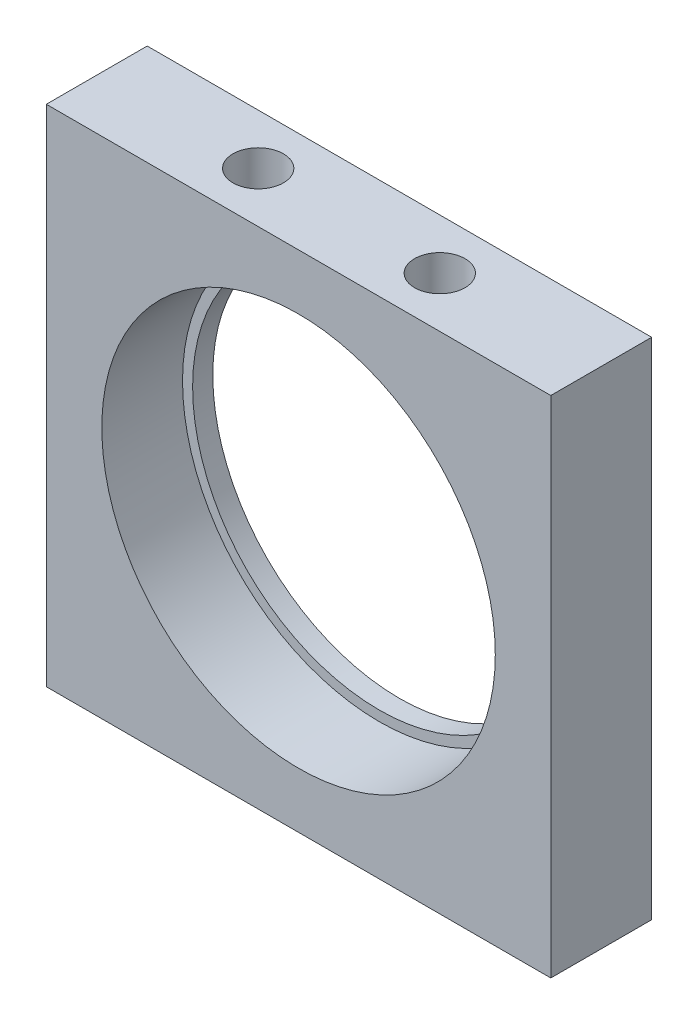
ISO-10303-21;
HEADER;
FILE_DESCRIPTION(('STEP AP214'),'2;1');
FILE_NAME('part.step','',(''),(''),'','','');
FILE_SCHEMA(('AUTOMOTIVE_DESIGN { 1 0 10303 214 1 1 1 1 }'));
ENDSEC;
DATA;
#1=APPLICATION_CONTEXT('core data for automotive mechanical design processes');
#2=APPLICATION_PROTOCOL_DEFINITION('international standard','automotive_design',2000,#1);
#3=PRODUCT_CONTEXT('',#1,'mechanical');
#4=PRODUCT('Part','Part','',(#3));
#5=PRODUCT_RELATED_PRODUCT_CATEGORY('part','',(#4));
#6=PRODUCT_DEFINITION_FORMATION('','',#4);
#7=PRODUCT_DEFINITION_CONTEXT('part definition',#1,'design');
#8=PRODUCT_DEFINITION('design','',#6,#7);
#9=PRODUCT_DEFINITION_SHAPE('','',#8);
#10=(LENGTH_UNIT() NAMED_UNIT(*) SI_UNIT(.MILLI.,.METRE.));
#11=(NAMED_UNIT(*) PLANE_ANGLE_UNIT() SI_UNIT($,.RADIAN.));
#12=(NAMED_UNIT(*) SI_UNIT($,.STERADIAN.) SOLID_ANGLE_UNIT());
#13=UNCERTAINTY_MEASURE_WITH_UNIT(LENGTH_MEASURE(1.E-05),#10,'distance_accuracy_value','');
#14=(GEOMETRIC_REPRESENTATION_CONTEXT(3) GLOBAL_UNCERTAINTY_ASSIGNED_CONTEXT((#13)) GLOBAL_UNIT_ASSIGNED_CONTEXT((#10,
#11,#12)) REPRESENTATION_CONTEXT('',''));
#15=CARTESIAN_POINT('',(0.,0.,0.));
#16=DIRECTION('',(0.,0.,1.));
#17=DIRECTION('',(1.,0.,0.));
#18=AXIS2_PLACEMENT_3D('',#15,#16,#17);
#19=CARTESIAN_POINT('',(-12.5,-12.5,5.));
#20=DIRECTION('',(0.,0.,-1.));
#21=DIRECTION('',(-1.,0.,0.));
#22=AXIS2_PLACEMENT_3D('',#19,#20,#21);
#23=PLANE('',#22);
#24=CARTESIAN_POINT('',(0.,0.,5.));
#25=DIRECTION('',(0.,0.,1.));
#26=DIRECTION('',(1.,0.,0.));
#27=AXIS2_PLACEMENT_3D('',#24,#25,#26);
#28=CIRCLE('',#27,9.75);
#29=CARTESIAN_POINT('',(9.75,0.,5.));
#30=VERTEX_POINT('',#29);
#31=EDGE_CURVE('E185',#30,#30,#28,.T.);
#32=ORIENTED_EDGE('',*,*,#31,.F.);
#33=EDGE_LOOP('',(#32));
#34=FACE_BOUND('',#33,.T.);
#35=DIRECTION('',(0.,-1.,0.));
#36=VECTOR('',#35,1.);
#37=CARTESIAN_POINT('',(-12.5,12.5,5.));
#38=LINE('',#37,#36);
#39=CARTESIAN_POINT('',(-12.5,12.5,5.));
#40=VERTEX_POINT('',#39);
#41=CARTESIAN_POINT('',(-12.5,-12.5,5.));
#42=VERTEX_POINT('',#41);
#43=EDGE_CURVE('E88',#40,#42,#38,.T.);
#44=ORIENTED_EDGE('',*,*,#43,.T.);
#45=DIRECTION('',(1.,0.,0.));
#46=VECTOR('',#45,1.);
#47=CARTESIAN_POINT('',(12.5,-12.5,5.));
#48=LINE('',#47,#46);
#49=CARTESIAN_POINT('',(12.5,-12.5,5.));
#50=VERTEX_POINT('',#49);
#51=EDGE_CURVE('E84',#42,#50,#48,.T.);
#52=ORIENTED_EDGE('',*,*,#51,.T.);
#53=DIRECTION('',(0.,1.,0.));
#54=VECTOR('',#53,1.);
#55=CARTESIAN_POINT('',(12.5,12.5,5.));
#56=LINE('',#55,#54);
#57=CARTESIAN_POINT('',(12.5,12.5,5.));
#58=VERTEX_POINT('',#57);
#59=EDGE_CURVE('E86',#50,#58,#56,.T.);
#60=ORIENTED_EDGE('',*,*,#59,.T.);
#61=DIRECTION('',(-1.,0.,0.));
#62=VECTOR('',#61,1.);
#63=CARTESIAN_POINT('',(12.5,12.5,5.));
#64=LINE('',#63,#62);
#65=EDGE_CURVE('E54',#58,#40,#64,.T.);
#66=ORIENTED_EDGE('',*,*,#65,.T.);
#67=EDGE_LOOP('',(#44,#52,#60,#66));
#68=FACE_BOUND('',#67,.T.);
#69=ADVANCED_FACE('F35',(#34,#68),#23,.F.);
#70=CARTESIAN_POINT('',(-12.5,-12.5,0.));
#71=DIRECTION('',(0.,0.,-1.));
#72=DIRECTION('',(-1.,0.,0.));
#73=AXIS2_PLACEMENT_3D('',#70,#71,#72);
#74=PLANE('',#73);
#75=DIRECTION('',(0.,-1.,0.));
#76=VECTOR('',#75,1.);
#77=CARTESIAN_POINT('',(-12.5,12.5,0.));
#78=LINE('',#77,#76);
#79=CARTESIAN_POINT('',(-12.5,12.5,0.));
#80=VERTEX_POINT('',#79);
#81=CARTESIAN_POINT('',(-12.5,-12.5,0.));
#82=VERTEX_POINT('',#81);
#83=EDGE_CURVE('E101',#80,#82,#78,.T.);
#84=ORIENTED_EDGE('',*,*,#83,.F.);
#85=DIRECTION('',(-1.,0.,0.));
#86=VECTOR('',#85,1.);
#87=CARTESIAN_POINT('',(12.5,12.5,0.));
#88=LINE('',#87,#86);
#89=CARTESIAN_POINT('',(12.5,12.5,0.));
#90=VERTEX_POINT('',#89);
#91=EDGE_CURVE('E77',#90,#80,#88,.T.);
#92=ORIENTED_EDGE('',*,*,#91,.F.);
#93=DIRECTION('',(0.,1.,0.));
#94=VECTOR('',#93,1.);
#95=CARTESIAN_POINT('',(12.5,12.5,0.));
#96=LINE('',#95,#94);
#97=CARTESIAN_POINT('',(12.5,-12.5,0.));
#98=VERTEX_POINT('',#97);
#99=EDGE_CURVE('E71',#98,#90,#96,.T.);
#100=ORIENTED_EDGE('',*,*,#99,.F.);
#101=DIRECTION('',(1.,0.,0.));
#102=VECTOR('',#101,1.);
#103=CARTESIAN_POINT('',(12.5,-12.5,0.));
#104=LINE('',#103,#102);
#105=EDGE_CURVE('E92',#82,#98,#104,.T.);
#106=ORIENTED_EDGE('',*,*,#105,.F.);
#107=EDGE_LOOP('',(#84,#92,#100,#106));
#108=FACE_BOUND('',#107,.T.);
#109=CARTESIAN_POINT('',(0.,0.,0.));
#110=DIRECTION('',(0.,0.,1.));
#111=DIRECTION('',(1.,0.,0.));
#112=AXIS2_PLACEMENT_3D('',#109,#110,#111);
#113=CIRCLE('',#112,9.25);
#114=CARTESIAN_POINT('',(9.25,0.,0.));
#115=VERTEX_POINT('',#114);
#116=EDGE_CURVE('E104',#115,#115,#113,.T.);
#117=ORIENTED_EDGE('',*,*,#116,.T.);
#118=EDGE_LOOP('',(#117));
#119=FACE_BOUND('',#118,.T.);
#120=ADVANCED_FACE('F148',(#108,#119),#74,.T.);
#121=CARTESIAN_POINT('',(-12.5,12.5,5.));
#122=DIRECTION('',(1.,0.,0.));
#123=DIRECTION('',(0.,1.,0.));
#124=AXIS2_PLACEMENT_3D('',#121,#122,#123);
#125=PLANE('',#124);
#126=ORIENTED_EDGE('',*,*,#83,.T.);
#127=DIRECTION('',(0.,0.,-1.));
#128=VECTOR('',#127,1.);
#129=CARTESIAN_POINT('',(-12.5,-12.5,5.));
#130=LINE('',#129,#128);
#131=EDGE_CURVE('E12',#42,#82,#130,.T.);
#132=ORIENTED_EDGE('',*,*,#131,.F.);
#133=ORIENTED_EDGE('',*,*,#43,.F.);
#134=DIRECTION('',(0.,0.,-1.));
#135=VECTOR('',#134,1.);
#136=CARTESIAN_POINT('',(-12.5,12.5,5.));
#137=LINE('',#136,#135);
#138=EDGE_CURVE('E97',#40,#80,#137,.T.);
#139=ORIENTED_EDGE('',*,*,#138,.T.);
#140=EDGE_LOOP('',(#126,#132,#133,#139));
#141=FACE_BOUND('',#140,.T.);
#142=ADVANCED_FACE('F37',(#141),#125,.F.);
#143=CARTESIAN_POINT('',(12.5,-12.5,5.));
#144=DIRECTION('',(0.,1.,0.));
#145=DIRECTION('',(-1.,0.,0.));
#146=AXIS2_PLACEMENT_3D('',#143,#144,#145);
#147=PLANE('',#146);
#148=ORIENTED_EDGE('',*,*,#105,.T.);
#149=DIRECTION('',(0.,0.,-1.));
#150=VECTOR('',#149,1.);
#151=CARTESIAN_POINT('',(12.5,-12.5,5.));
#152=LINE('',#151,#150);
#153=EDGE_CURVE('E45',#50,#98,#152,.T.);
#154=ORIENTED_EDGE('',*,*,#153,.F.);
#155=ORIENTED_EDGE('',*,*,#51,.F.);
#156=ORIENTED_EDGE('',*,*,#131,.T.);
#157=EDGE_LOOP('',(#148,#154,#155,#156));
#158=FACE_BOUND('',#157,.T.);
#159=ADVANCED_FACE('F91',(#158),#147,.F.);
#160=CARTESIAN_POINT('',(12.5,12.5,5.));
#161=DIRECTION('',(-1.,0.,0.));
#162=DIRECTION('',(0.,-1.,0.));
#163=AXIS2_PLACEMENT_3D('',#160,#161,#162);
#164=PLANE('',#163);
#165=ORIENTED_EDGE('',*,*,#99,.T.);
#166=DIRECTION('',(0.,0.,-1.));
#167=VECTOR('',#166,1.);
#168=CARTESIAN_POINT('',(12.5,12.5,5.));
#169=LINE('',#168,#167);
#170=EDGE_CURVE('E93',#58,#90,#169,.T.);
#171=ORIENTED_EDGE('',*,*,#170,.F.);
#172=ORIENTED_EDGE('',*,*,#59,.F.);
#173=ORIENTED_EDGE('',*,*,#153,.T.);
#174=EDGE_LOOP('',(#165,#171,#172,#173));
#175=FACE_BOUND('',#174,.T.);
#176=ADVANCED_FACE('F95',(#175),#164,.F.);
#177=CARTESIAN_POINT('',(12.5,12.5,5.));
#178=DIRECTION('',(0.,-1.,0.));
#179=DIRECTION('',(1.,0.,0.));
#180=AXIS2_PLACEMENT_3D('',#177,#178,#179);
#181=PLANE('',#180);
#182=CARTESIAN_POINT('',(-4.50000000000001,12.5,2.5));
#183=DIRECTION('',(0.,1.,0.));
#184=DIRECTION('',(0.,0.,1.));
#185=AXIS2_PLACEMENT_3D('',#182,#183,#184);
#186=CIRCLE('',#185,1.25);
#187=CARTESIAN_POINT('',(-4.50000000000001,12.5,3.75));
#188=VERTEX_POINT('',#187);
#189=EDGE_CURVE('E134',#188,#188,#186,.T.);
#190=ORIENTED_EDGE('',*,*,#189,.F.);
#191=EDGE_LOOP('',(#190));
#192=FACE_BOUND('',#191,.T.);
#193=CARTESIAN_POINT('',(4.5,12.5,2.5));
#194=DIRECTION('',(0.,1.,0.));
#195=DIRECTION('',(0.,0.,1.));
#196=AXIS2_PLACEMENT_3D('',#193,#194,#195);
#197=CIRCLE('',#196,1.25);
#198=CARTESIAN_POINT('',(4.5,12.5,3.75));
#199=VERTEX_POINT('',#198);
#200=EDGE_CURVE('E169',#199,#199,#197,.T.);
#201=ORIENTED_EDGE('',*,*,#200,.F.);
#202=EDGE_LOOP('',(#201));
#203=FACE_BOUND('',#202,.T.);
#204=ORIENTED_EDGE('',*,*,#91,.T.);
#205=ORIENTED_EDGE('',*,*,#138,.F.);
#206=ORIENTED_EDGE('',*,*,#65,.F.);
#207=ORIENTED_EDGE('',*,*,#170,.T.);
#208=EDGE_LOOP('',(#204,#205,#206,#207));
#209=FACE_BOUND('',#208,.T.);
#210=ADVANCED_FACE('F144',(#192,#203,#209),#181,.F.);
#211=CARTESIAN_POINT('',(0.,0.,5.));
#212=DIRECTION('',(0.,0.,-1.));
#213=DIRECTION('',(-1.,0.,0.));
#214=AXIS2_PLACEMENT_3D('',#211,#212,#213);
#215=CYLINDRICAL_SURFACE('',#214,9.25);
#216=CARTESIAN_POINT('',(0.,0.,1.));
#217=DIRECTION('',(0.,0.,-1.));
#218=DIRECTION('',(-1.,0.,0.));
#219=AXIS2_PLACEMENT_3D('',#216,#217,#218);
#220=CIRCLE('',#219,9.25);
#221=CARTESIAN_POINT('',(-9.25,0.,1.));
#222=VERTEX_POINT('',#221);
#223=EDGE_CURVE('E39',#222,#222,#220,.T.);
#224=ORIENTED_EDGE('',*,*,#223,.F.);
#225=EDGE_LOOP('',(#224));
#226=FACE_BOUND('',#225,.T.);
#227=ORIENTED_EDGE('',*,*,#116,.F.);
#228=EDGE_LOOP('',(#227));
#229=FACE_BOUND('',#228,.T.);
#230=ADVANCED_FACE('F140',(#226,#229),#215,.F.);
#231=CARTESIAN_POINT('',(4.5,12.5,2.5));
#232=DIRECTION('',(0.,1.,0.));
#233=DIRECTION('',(0.,0.,1.));
#234=AXIS2_PLACEMENT_3D('',#231,#232,#233);
#235=CYLINDRICAL_SURFACE('',#234,1.25);
#236=CARTESIAN_POINT('',(4.5,8.6494219460031,3.75));
#237=CARTESIAN_POINT('',(4.42647904401307,8.68767252681186,3.74999935614414));
#238=CARTESIAN_POINT('',(4.35246042268599,8.72498066540459,3.7435092972828));
#239=CARTESIAN_POINT('',(4.20543919023596,8.79678734520722,3.71708966438417));
#240=CARTESIAN_POINT('',(4.1324363570936,8.8312865086303,3.69716307578532));
#241=CARTESIAN_POINT('',(3.98950649545358,8.89677160341226,3.64356666839533));
#242=CARTESIAN_POINT('',(3.91959415829288,8.92774167115214,3.60983769898936));
#243=CARTESIAN_POINT('',(3.78595391413466,8.98522929715541,3.52894565044824));
#244=CARTESIAN_POINT('',(3.7222235012969,9.01174866271871,3.48178804536957));
#245=CARTESIAN_POINT('',(3.60877479364,9.05774190582341,3.37952234099835));
#246=CARTESIAN_POINT('',(3.55833268983893,9.07761774535094,3.32539827596536));
#247=CARTESIAN_POINT('',(3.46726973492604,9.11278935782523,3.20814475351491));
#248=CARTESIAN_POINT('',(3.42664383387611,9.12808748674172,3.14501995321173));
#249=CARTESIAN_POINT('',(3.3598394417507,9.15287671831459,3.01703786261558));
#250=CARTESIAN_POINT('',(3.33277125966542,9.16273189934026,2.95271416621646));
#251=CARTESIAN_POINT('',(3.28964462609119,9.17830427222974,2.82000427037378));
#252=CARTESIAN_POINT('',(3.27358297923091,9.18402266509548,2.75161925626538));
#253=CARTESIAN_POINT('',(3.25357774079943,9.19112830478094,2.61590591824626));
#254=CARTESIAN_POINT('',(3.2491423102919,9.19269138225856,2.54865880762669));
#255=CARTESIAN_POINT('',(3.25113138279628,9.19198816147049,2.41434942411091));
#256=CARTESIAN_POINT('',(3.25755460004429,9.18972231658451,2.34728713027246));
#257=CARTESIAN_POINT('',(3.28086098744651,9.18142685032465,2.21613198168981));
#258=CARTESIAN_POINT('',(3.29761089051569,9.17544517482748,2.15201230450777));
#259=CARTESIAN_POINT('',(3.34082319757586,9.15979937950262,2.0276179960784));
#260=CARTESIAN_POINT('',(3.36728563972061,9.15013524520912,1.96734337993671));
#261=CARTESIAN_POINT('',(3.42933992050219,9.12706041032305,1.85149544052908));
#262=CARTESIAN_POINT('',(3.46504064185647,9.11360484294994,1.79598949622893));
#263=CARTESIAN_POINT('',(3.54412534679001,9.08314190333844,1.69186635065665));
#264=CARTESIAN_POINT('',(3.58751027701339,9.06613409344075,1.64324999946705));
#265=CARTESIAN_POINT('',(3.68231430040483,9.02805430793769,1.55217269579069));
#266=CARTESIAN_POINT('',(3.73398009190832,9.00685007861705,1.51002437111578));
#267=CARTESIAN_POINT('',(3.84231618197041,8.96116970021547,1.4349652390239));
#268=CARTESIAN_POINT('',(3.89898776990057,8.93669270731118,1.40205682075704));
#269=CARTESIAN_POINT('',(4.01966391262861,8.88309892019418,1.34390117253012));
#270=CARTESIAN_POINT('',(4.08390486811086,8.85377918084761,1.31933287348266));
#271=CARTESIAN_POINT('',(4.21432413824495,8.79244974670136,1.28118437458149));
#272=CARTESIAN_POINT('',(4.2805031836064,8.76043902859919,1.26760837584086));
#273=CARTESIAN_POINT('',(4.41929041427393,8.69131265051521,1.25047421980043));
#274=CARTESIAN_POINT('',(4.49192810018223,8.6539985283569,1.24795660628319));
#275=CARTESIAN_POINT('',(4.63574546936008,8.57782015735402,1.25530562924678));
#276=CARTESIAN_POINT('',(4.70692456168974,8.5389552983236,1.26517718810178));
#277=CARTESIAN_POINT('',(4.85243189518405,8.4571840423471,1.29819396986848));
#278=CARTESIAN_POINT('',(4.92648315681509,8.41422382474772,1.32243438020245));
#279=CARTESIAN_POINT('',(5.06924164956709,8.32899825507054,1.38441666728189));
#280=CARTESIAN_POINT('',(5.13794415991285,8.2867335422109,1.42217030987404));
#281=CARTESIAN_POINT('',(5.26980027008964,8.20353206627536,1.51185289968367));
#282=CARTESIAN_POINT('',(5.33276015083278,8.16265956387328,1.56412889190913));
#283=CARTESIAN_POINT('',(5.44858694574485,8.08580358835116,1.68178940860738));
#284=CARTESIAN_POINT('',(5.5014728025841,8.04981097683476,1.747148847175));
#285=CARTESIAN_POINT('',(5.58090998546863,7.99484676417099,1.86927705969086));
#286=CARTESIAN_POINT('',(5.61066100587826,7.97395676004386,1.92311231186616));
#287=CARTESIAN_POINT('',(5.66236293132863,7.93732638465802,2.03604082301111));
#288=CARTESIAN_POINT('',(5.68432053482804,7.92158159200646,2.09512951174138));
#289=CARTESIAN_POINT('',(5.71936455640636,7.89631859967107,2.21763099911013));
#290=CARTESIAN_POINT('',(5.73239170892156,7.88684201226052,2.28106966979122));
#291=CARTESIAN_POINT('',(5.74842953314975,7.87516114723848,2.40985756613575));
#292=CARTESIAN_POINT('',(5.75144575159986,7.87295284251061,2.47520571356354));
#293=CARTESIAN_POINT('',(5.74748405415644,7.87584441750188,2.59826801718392));
#294=CARTESIAN_POINT('',(5.74155851166513,7.88017478397993,2.65603869154882));
#295=CARTESIAN_POINT('',(5.72195427200127,7.89442108003648,2.76952536337789));
#296=CARTESIAN_POINT('',(5.70827504844506,7.90433738883442,2.82524122107065));
#297=CARTESIAN_POINT('',(5.67376917656883,7.92914198921919,2.93361678857137));
#298=CARTESIAN_POINT('',(5.65289790081489,7.94406130910874,2.98625495697252));
#299=CARTESIAN_POINT('',(5.60492211683468,7.97798279488953,3.08717355506656));
#300=CARTESIAN_POINT('',(5.57781538486513,7.99698641720144,3.13545242153273));
#301=CARTESIAN_POINT('',(5.51421962446085,8.04099294917224,3.23328579679062));
#302=CARTESIAN_POINT('',(5.47695697037633,8.06645985553688,3.28212668011423));
#303=CARTESIAN_POINT('',(5.39671139071474,8.1203661575268,3.37297660334663));
#304=CARTESIAN_POINT('',(5.35372497753922,8.14880736316515,3.41498144296478));
#305=CARTESIAN_POINT('',(5.25486887266755,8.21297211378566,3.49879474441473));
#306=CARTESIAN_POINT('',(5.19807193975923,8.24908614105253,3.53921290849355));
#307=CARTESIAN_POINT('',(5.07928186661258,8.32275741215063,3.60982577432532));
#308=CARTESIAN_POINT('',(5.0172852185725,8.36031562084529,3.64001350414208));
#309=CARTESIAN_POINT('',(4.88150316535907,8.44040068376708,3.69284943958863));
#310=CARTESIAN_POINT('',(4.80720411144179,8.48297241896068,3.71412044839279));
#311=CARTESIAN_POINT('',(4.6554566493717,8.56719037574786,3.74269558494595));
#312=CARTESIAN_POINT('',(4.57800846042724,8.60883666145008,3.75000068315493));
#313=CARTESIAN_POINT('',(4.5,8.6494219460031,3.75));
#314=B_SPLINE_CURVE_WITH_KNOTS('',3,(#236,#237,#238,#239,#240,#241,#242,#243,#244,#245,#246,
#247,#248,#249,#250,#251,#252,#253,#254,#255,#256,#257,#258,#259,#260,#261,#262,#263,#264,#265,
#266,#267,#268,#269,#270,#271,#272,#273,#274,#275,#276,#277,#278,#279,#280,#281,#282,#283,#284,
#285,#286,#287,#288,#289,#290,#291,#292,#293,#294,#295,#296,#297,#298,#299,#300,#301,#302,#303,
#304,#305,#306,#307,#308,#309,#310,#311,#312,#313),.UNSPECIFIED.,.T.,.F.,(4,2,2,2,2,2,2,2,2,2,2,
2,2,2,2,2,2,2,2,2,2,2,2,2,2,2,2,2,2,2,2,2,2,2,2,2,2,2,4),(0.,0.248353871957811,0.49665258078949,
0.746026716322311,0.995299342009322,1.22389380287841,1.45237041191118,1.6627434653857,
1.87305541832987,2.07431493556558,2.27555062348987,2.47424217995503,2.67293451694864,
2.87408470824762,3.07525969718824,3.28425261930356,3.49329953077585,3.71666143131091,
3.94010865759517,4.18418432953829,4.4283570065259,4.69409204408854,4.96005901978542,
5.2330285276107,5.50547957844813,5.69959182050578,5.89353681633065,6.08875675232371,
6.2838685051461,6.45773714048694,6.63161758087509,6.80659699776267,6.98163891436135,
7.18039994374431,7.37928264110533,7.613886147424,7.84864921362683,8.11218019347347,
8.37569286047439),.UNSPECIFIED.);
#315=CARTESIAN_POINT('',(4.5,8.6494219460031,3.75));
#316=VERTEX_POINT('',#315);
#317=EDGE_CURVE('E115',#316,#316,#314,.T.);
#318=ORIENTED_EDGE('',*,*,#317,.T.);
#319=EDGE_LOOP('',(#318));
#320=FACE_BOUND('',#319,.T.);
#321=ORIENTED_EDGE('',*,*,#200,.T.);
#322=EDGE_LOOP('',(#321));
#323=FACE_BOUND('',#322,.T.);
#324=ADVANCED_FACE('F136',(#320,#323),#235,.F.);
#325=CARTESIAN_POINT('',(-4.50000000000001,12.5,2.5));
#326=DIRECTION('',(0.,1.,0.));
#327=DIRECTION('',(0.,0.,1.));
#328=AXIS2_PLACEMENT_3D('',#325,#326,#327);
#329=CYLINDRICAL_SURFACE('',#328,1.25);
#330=CARTESIAN_POINT('',(-4.50000000000001,8.64942194600309,3.75));
#331=CARTESIAN_POINT('',(-4.59469874609231,8.6001492628592,3.7499958281766));
#332=CARTESIAN_POINT('',(-4.6887074163499,8.54923801272972,3.73921547018215));
#333=CARTESIAN_POINT('',(-4.87163719321549,8.44634409589631,3.69717819245719));
#334=CARTESIAN_POINT('',(-4.96054426765404,8.39435896328038,3.6658674879788));
#335=CARTESIAN_POINT('',(-5.11703459000231,8.29973044630425,3.59001951303643));
#336=CARTESIAN_POINT('',(-5.18580866420732,8.25686395252004,3.54820113442505));
#337=CARTESIAN_POINT('',(-5.31510747262551,8.17422731948908,3.45111145268732));
#338=CARTESIAN_POINT('',(-5.37565015098275,8.13445052873583,3.39587016888479));
#339=CARTESIAN_POINT('',(-5.47382956793916,8.06860469218659,3.28631965809863));
#340=CARTESIAN_POINT('',(-5.51356577983417,8.0414547316965,3.23453700078746));
#341=CARTESIAN_POINT('',(-5.58524667930758,7.99183445061609,3.12376571473648));
#342=CARTESIAN_POINT('',(-5.61719402266042,7.96936253533335,3.06477955250468));
#343=CARTESIAN_POINT('',(-5.67194503164571,7.9304909124118,2.94012972592913));
#344=CARTESIAN_POINT('',(-5.69466822600391,7.91414473651636,2.87441330590218));
#345=CARTESIAN_POINT('',(-5.72897837570765,7.88934532993859,2.73872386770134));
#346=CARTESIAN_POINT('',(-5.74057943984394,7.88088209986734,2.66875636236637));
#347=CARTESIAN_POINT('',(-5.7508968702912,7.87335464555671,2.53776446836607));
#348=CARTESIAN_POINT('',(-5.75125266188694,7.87309452190783,2.47693255095906));
#349=CARTESIAN_POINT('',(-5.74317090445576,7.87899190923829,2.35618104160148));
#350=CARTESIAN_POINT('',(-5.73473495061639,7.88514825600357,2.29626128614797));
#351=CARTESIAN_POINT('',(-5.71030641678314,7.90285445627772,2.18241052377652));
#352=CARTESIAN_POINT('',(-5.6947593588459,7.91408590371345,2.12833172042459));
#353=CARTESIAN_POINT('',(-5.65705512624687,7.94108069574638,2.02374810125723));
#354=CARTESIAN_POINT('',(-5.63489639887622,7.95684510484941,1.97324412841894));
#355=CARTESIAN_POINT('',(-5.58237493684744,7.99379224539891,1.87188092608862));
#356=CARTESIAN_POINT('',(-5.5514229784794,8.01535339042408,1.82146711210969));
#357=CARTESIAN_POINT('',(-5.48366417169295,8.0618619029428,1.72649284144566));
#358=CARTESIAN_POINT('',(-5.44685407464558,8.08681114817348,1.6819356577344));
#359=CARTESIAN_POINT('',(-5.36148624245265,8.143710858613,1.59179560518907));
#360=CARTESIAN_POINT('',(-5.31199900956606,8.17612396941694,1.54738502934815));
#361=CARTESIAN_POINT('',(-5.20756704073711,8.24303344270756,1.46744016075823));
#362=CARTESIAN_POINT('',(-5.15261878278918,8.27753114392417,1.43191164896354));
#363=CARTESIAN_POINT('',(-5.029237294742,8.35316088771665,1.36506243539883));
#364=CARTESIAN_POINT('',(-4.96005257557138,8.39447189570485,1.33532234746495));
#365=CARTESIAN_POINT('',(-4.81746666014678,8.47710531579303,1.28865916736609));
#366=CARTESIAN_POINT('',(-4.74406337810972,8.51842772330446,1.27174247515287));
#367=CARTESIAN_POINT('',(-4.58983104977864,8.60256652720796,1.25065012615951));
#368=CARTESIAN_POINT('',(-4.50883076368871,8.64530308699038,1.24738314499575));
#369=CARTESIAN_POINT('',(-4.34636428545365,8.72811110377539,1.25681407239685));
#370=CARTESIAN_POINT('',(-4.26489817707439,8.76818302453055,1.26950919522729));
#371=CARTESIAN_POINT('',(-4.10802253219394,8.84272877787015,1.31041108895148));
#372=CARTESIAN_POINT('',(-4.0325059333374,8.87737415632844,1.33788757223732));
#373=CARTESIAN_POINT('',(-3.88665580145319,8.94219030051329,1.40783013300302));
#374=CARTESIAN_POINT('',(-3.8163186034528,8.97236424585928,1.45028548572699));
#375=CARTESIAN_POINT('',(-3.69070807627469,9.02470766541018,1.54444701214225));
#376=CARTESIAN_POINT('',(-3.6346318235005,9.04737566769032,1.59480516521843));
#377=CARTESIAN_POINT('',(-3.53174738001818,9.08803194072986,1.70583178149294));
#378=CARTESIAN_POINT('',(-3.48493371367495,9.10602297829216,1.76649411365254));
#379=CARTESIAN_POINT('',(-3.40642205920819,9.13566633295134,1.89050000923727));
#380=CARTESIAN_POINT('',(-3.37375205648096,9.1477391476771,1.9531293243668));
#381=CARTESIAN_POINT('',(-3.31928800099549,9.16764277025004,2.08357641772708));
#382=CARTESIAN_POINT('',(-3.29749021678449,9.17547503357537,2.15139240661113));
#383=CARTESIAN_POINT('',(-3.26652382335876,9.1865433830141,2.28648163135374));
#384=CARTESIAN_POINT('',(-3.25676000988888,9.18999635340757,2.35360132656449));
#385=CARTESIAN_POINT('',(-3.24822381860236,9.19301714825026,2.48861938269234));
#386=CARTESIAN_POINT('',(-3.24944975417293,9.19258556886693,2.55651762252768));
#387=CARTESIAN_POINT('',(-3.26271275812568,9.18788612081164,2.68978760795843));
#388=CARTESIAN_POINT('',(-3.27454177967348,9.18369207549814,2.75518283207844));
#389=CARTESIAN_POINT('',(-3.308274121277,9.17159421546038,2.88295589210876));
#390=CARTESIAN_POINT('',(-3.3301772504862,9.16369047101356,2.94533378515543));
#391=CARTESIAN_POINT('',(-3.38341839169663,9.14416668171366,3.06578208159905));
#392=CARTESIAN_POINT('',(-3.41481651609121,9.13252292894693,3.12382201239866));
#393=CARTESIAN_POINT('',(-3.48585283327146,9.10564481178702,3.23367967065601));
#394=CARTESIAN_POINT('',(-3.52549145577341,9.09041026013934,3.28549707340591));
#395=CARTESIAN_POINT('',(-3.61302684529062,9.0559821714852,3.38330194139615));
#396=CARTESIAN_POINT('',(-3.66114745359968,9.03667745813574,3.42904951475536));
#397=CARTESIAN_POINT('',(-3.76309221528898,8.99470255943217,3.51182126456561));
#398=CARTESIAN_POINT('',(-3.81691894160733,8.97203085400898,3.54884148131296));
#399=CARTESIAN_POINT('',(-3.93206875883796,8.92219176721871,3.61564095659583));
#400=CARTESIAN_POINT('',(-3.99364953736452,8.89483316289554,3.64483148225392));
#401=CARTESIAN_POINT('',(-4.11946848069217,8.83726530388719,3.69256885852073));
#402=CARTESIAN_POINT('',(-4.18370475159863,8.80705806180062,3.71112315911605));
#403=CARTESIAN_POINT('',(-4.29018639356117,8.75551037618341,3.73300373889838));
#404=CARTESIAN_POINT('',(-4.33214900440589,8.73482597232281,3.7393971498851));
#405=CARTESIAN_POINT('',(-4.41611937698804,8.692675292373,3.74789680002945));
#406=CARTESIAN_POINT('',(-4.45812714804559,8.67120880012542,3.75000184465107));
#407=CARTESIAN_POINT('',(-4.50000000000001,8.64942194600309,3.75));
#408=B_SPLINE_CURVE_WITH_KNOTS('',3,(#330,#331,#332,#333,#334,#335,#336,#337,#338,#339,#340,
#341,#342,#343,#344,#345,#346,#347,#348,#349,#350,#351,#352,#353,#354,#355,#356,#357,#358,#359,
#360,#361,#362,#363,#364,#365,#366,#367,#368,#369,#370,#371,#372,#373,#374,#375,#376,#377,#378,
#379,#380,#381,#382,#383,#384,#385,#386,#387,#388,#389,#390,#391,#392,#393,#394,#395,#396,#397,
#398,#399,#400,#401,#402,#403,#404,#405,#406,#407),.UNSPECIFIED.,.T.,.F.,(4,2,2,2,2,2,2,2,2,2,2,
2,2,2,2,2,2,2,2,2,2,2,2,2,2,2,2,2,2,2,2,2,2,2,2,2,2,2,4),(0.,0.320016165353017,
0.640874066580684,0.913172635167755,1.18486774445645,1.39612030234809,1.60730072829216,
1.82028581843282,2.03300037103341,2.21453425512049,2.39603520715943,2.56745976925167,
2.73892462104927,2.92710638635015,3.11539287377611,3.33646394268241,3.5576785248396,
3.81425667479657,4.07096279464819,4.34450995257963,4.61800937720653,4.87909369873772,
5.1399914639891,5.37482320689184,5.60951571005072,5.82340582080855,6.03722247176765,
6.23997369306428,6.44269379836876,6.64152128268344,6.84034500051372,7.04045479465063,
7.24057502650818,7.44710507496962,7.65372864895624,7.87311898173775,8.09235545744815,
8.23381729314991,8.37531852804256),.UNSPECIFIED.);
#409=CARTESIAN_POINT('',(-4.50000000000001,8.64942194600309,3.75));
#410=VERTEX_POINT('',#409);
#411=EDGE_CURVE('E109',#410,#410,#408,.T.);
#412=ORIENTED_EDGE('',*,*,#411,.T.);
#413=EDGE_LOOP('',(#412));
#414=FACE_BOUND('',#413,.T.);
#415=ORIENTED_EDGE('',*,*,#189,.T.);
#416=EDGE_LOOP('',(#415));
#417=FACE_BOUND('',#416,.T.);
#418=ADVANCED_FACE('F117',(#414,#417),#329,.F.);
#419=CARTESIAN_POINT('',(0.,0.,-27.5771644662754));
#420=DIRECTION('',(0.,0.,1.));
#421=DIRECTION('',(1.,0.,0.));
#422=AXIS2_PLACEMENT_3D('',#419,#420,#421);
#423=CYLINDRICAL_SURFACE('',#422,9.75);
#424=ORIENTED_EDGE('',*,*,#411,.F.);
#425=EDGE_LOOP('',(#424));
#426=FACE_BOUND('',#425,.T.);
#427=ORIENTED_EDGE('',*,*,#31,.T.);
#428=EDGE_LOOP('',(#427));
#429=FACE_BOUND('',#428,.T.);
#430=CARTESIAN_POINT('',(0.,0.,1.));
#431=DIRECTION('',(0.,0.,-1.));
#432=DIRECTION('',(-1.,0.,0.));
#433=AXIS2_PLACEMENT_3D('',#430,#431,#432);
#434=CIRCLE('',#433,9.75);
#435=CARTESIAN_POINT('',(-9.75,0.,1.));
#436=VERTEX_POINT('',#435);
#437=EDGE_CURVE('E116',#436,#436,#434,.F.);
#438=ORIENTED_EDGE('',*,*,#437,.F.);
#439=EDGE_LOOP('',(#438));
#440=FACE_BOUND('',#439,.T.);
#441=ORIENTED_EDGE('',*,*,#317,.F.);
#442=EDGE_LOOP('',(#441));
#443=FACE_BOUND('',#442,.T.);
#444=ADVANCED_FACE('F121',(#426,#429,#440,#443),#423,.F.);
#445=CARTESIAN_POINT('',(-12.5,-12.5,1.));
#446=DIRECTION('',(0.,0.,-1.));
#447=DIRECTION('',(-1.,0.,0.));
#448=AXIS2_PLACEMENT_3D('',#445,#446,#447);
#449=PLANE('',#448);
#450=ORIENTED_EDGE('',*,*,#223,.T.);
#451=EDGE_LOOP('',(#450));
#452=FACE_BOUND('',#451,.T.);
#453=ORIENTED_EDGE('',*,*,#437,.T.);
#454=EDGE_LOOP('',(#453));
#455=FACE_BOUND('',#454,.T.);
#456=ADVANCED_FACE('F124',(#452,#455),#449,.F.);
#457=CLOSED_SHELL('',(#69,#120,#142,#159,#176,#210,#230,#324,#418,#444,#456));
#458=MANIFOLD_SOLID_BREP('B2',#457);
#459=ADVANCED_BREP_SHAPE_REPRESENTATION('',(#18,#458),#14);
#460=SHAPE_DEFINITION_REPRESENTATION(#9,#459);
ENDSEC;
END-ISO-10303-21;
